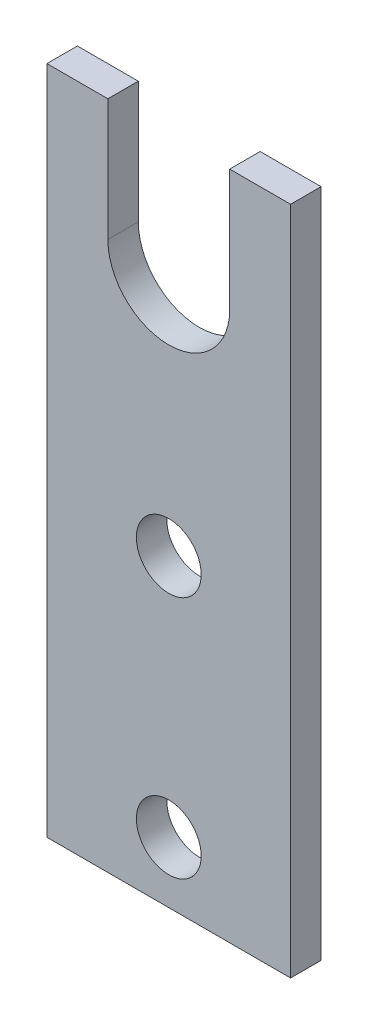
ISO-10303-21;
HEADER;
FILE_DESCRIPTION(('STEP AP214'),'2;1');
FILE_NAME('part.step','',(''),(''),'','','');
FILE_SCHEMA(('AUTOMOTIVE_DESIGN { 1 0 10303 214 1 1 1 1 }'));
ENDSEC;
DATA;
#1=APPLICATION_CONTEXT('core data for automotive mechanical design processes');
#2=APPLICATION_PROTOCOL_DEFINITION('international standard','automotive_design',2000,#1);
#3=PRODUCT_CONTEXT('',#1,'mechanical');
#4=PRODUCT('Part','Part','',(#3));
#5=PRODUCT_RELATED_PRODUCT_CATEGORY('part','',(#4));
#6=PRODUCT_DEFINITION_FORMATION('','',#4);
#7=PRODUCT_DEFINITION_CONTEXT('part definition',#1,'design');
#8=PRODUCT_DEFINITION('design','',#6,#7);
#9=PRODUCT_DEFINITION_SHAPE('','',#8);
#10=(LENGTH_UNIT() NAMED_UNIT(*) SI_UNIT(.MILLI.,.METRE.));
#11=(NAMED_UNIT(*) PLANE_ANGLE_UNIT() SI_UNIT($,.RADIAN.));
#12=(NAMED_UNIT(*) SI_UNIT($,.STERADIAN.) SOLID_ANGLE_UNIT());
#13=UNCERTAINTY_MEASURE_WITH_UNIT(LENGTH_MEASURE(1.E-05),#10,'distance_accuracy_value','');
#14=(GEOMETRIC_REPRESENTATION_CONTEXT(3) GLOBAL_UNCERTAINTY_ASSIGNED_CONTEXT((#13)) GLOBAL_UNIT_ASSIGNED_CONTEXT((#10,
#11,#12)) REPRESENTATION_CONTEXT('',''));
#15=CARTESIAN_POINT('',(0.,0.,0.));
#16=DIRECTION('',(0.,0.,1.));
#17=DIRECTION('',(1.,0.,0.));
#18=AXIS2_PLACEMENT_3D('',#15,#16,#17);
#19=CARTESIAN_POINT('',(-12.7,34.925,3.175));
#20=DIRECTION('',(0.,-1.,0.));
#21=DIRECTION('',(0.,0.,-1.));
#22=AXIS2_PLACEMENT_3D('',#19,#20,#21);
#23=PLANE('',#22);
#24=DIRECTION('',(-1.,0.,0.));
#25=VECTOR('',#24,1.);
#26=CARTESIAN_POINT('',(-12.7,34.925,0.));
#27=LINE('',#26,#25);
#28=CARTESIAN_POINT('',(12.7,34.925,0.));
#29=VERTEX_POINT('',#28);
#30=CARTESIAN_POINT('',(6.34999999999999,34.925,0.));
#31=VERTEX_POINT('',#30);
#32=EDGE_CURVE('E137',#29,#31,#27,.T.);
#33=ORIENTED_EDGE('',*,*,#32,.T.);
#34=DIRECTION('',(0.,0.,1.));
#35=VECTOR('',#34,1.);
#36=CARTESIAN_POINT('',(6.34999999999999,34.925,0.));
#37=LINE('',#36,#35);
#38=CARTESIAN_POINT('',(6.34999999999999,34.925,3.175));
#39=VERTEX_POINT('',#38);
#40=EDGE_CURVE('E143',#31,#39,#37,.T.);
#41=ORIENTED_EDGE('',*,*,#40,.T.);
#42=DIRECTION('',(-1.,0.,0.));
#43=VECTOR('',#42,1.);
#44=CARTESIAN_POINT('',(-12.7,34.925,3.175));
#45=LINE('',#44,#43);
#46=CARTESIAN_POINT('',(12.7,34.925,3.175));
#47=VERTEX_POINT('',#46);
#48=EDGE_CURVE('E91',#47,#39,#45,.T.);
#49=ORIENTED_EDGE('',*,*,#48,.F.);
#50=DIRECTION('',(0.,0.,-1.));
#51=VECTOR('',#50,1.);
#52=CARTESIAN_POINT('',(12.7,34.925,3.175));
#53=LINE('',#52,#51);
#54=EDGE_CURVE('E11',#47,#29,#53,.T.);
#55=ORIENTED_EDGE('',*,*,#54,.T.);
#56=EDGE_LOOP('',(#33,#41,#49,#55));
#57=FACE_BOUND('',#56,.T.);
#58=ADVANCED_FACE('F39',(#57),#23,.F.);
#59=CARTESIAN_POINT('',(12.7,-34.925,3.175));
#60=DIRECTION('',(-1.,0.,0.));
#61=DIRECTION('',(0.,0.,1.));
#62=AXIS2_PLACEMENT_3D('',#59,#60,#61);
#63=PLANE('',#62);
#64=DIRECTION('',(0.,1.,0.));
#65=VECTOR('',#64,1.);
#66=CARTESIAN_POINT('',(12.7,-34.925,0.));
#67=LINE('',#66,#65);
#68=CARTESIAN_POINT('',(12.7,-34.925,0.));
#69=VERTEX_POINT('',#68);
#70=EDGE_CURVE('E138',#69,#29,#67,.T.);
#71=ORIENTED_EDGE('',*,*,#70,.T.);
#72=ORIENTED_EDGE('',*,*,#54,.F.);
#73=DIRECTION('',(0.,1.,0.));
#74=VECTOR('',#73,1.);
#75=CARTESIAN_POINT('',(12.7,-34.925,3.175));
#76=LINE('',#75,#74);
#77=CARTESIAN_POINT('',(12.7,-34.925,3.175));
#78=VERTEX_POINT('',#77);
#79=EDGE_CURVE('E150',#78,#47,#76,.T.);
#80=ORIENTED_EDGE('',*,*,#79,.F.);
#81=DIRECTION('',(0.,0.,-1.));
#82=VECTOR('',#81,1.);
#83=CARTESIAN_POINT('',(12.7,-34.925,3.175));
#84=LINE('',#83,#82);
#85=EDGE_CURVE('E151',#78,#69,#84,.T.);
#86=ORIENTED_EDGE('',*,*,#85,.T.);
#87=EDGE_LOOP('',(#71,#72,#80,#86));
#88=FACE_BOUND('',#87,.T.);
#89=ADVANCED_FACE('F41',(#88),#63,.F.);
#90=CARTESIAN_POINT('',(-6.35,34.925,3.175));
#91=VERTEX_POINT('',#90);
#92=CARTESIAN_POINT('',(-12.7,34.925,3.175));
#93=VERTEX_POINT('',#92);
#94=EDGE_CURVE('E130',#91,#93,#45,.T.);
#95=ORIENTED_EDGE('',*,*,#94,.F.);
#96=DIRECTION('',(0.,0.,1.));
#97=VECTOR('',#96,1.);
#98=CARTESIAN_POINT('',(-6.35,34.925,0.));
#99=LINE('',#98,#97);
#100=CARTESIAN_POINT('',(-6.35,34.925,0.));
#101=VERTEX_POINT('',#100);
#102=EDGE_CURVE('E117',#101,#91,#99,.T.);
#103=ORIENTED_EDGE('',*,*,#102,.F.);
#104=CARTESIAN_POINT('',(-12.7,34.925,0.));
#105=VERTEX_POINT('',#104);
#106=EDGE_CURVE('E128',#101,#105,#27,.T.);
#107=ORIENTED_EDGE('',*,*,#106,.T.);
#108=DIRECTION('',(0.,0.,-1.));
#109=VECTOR('',#108,1.);
#110=CARTESIAN_POINT('',(-12.7,34.925,3.175));
#111=LINE('',#110,#109);
#112=EDGE_CURVE('E47',#93,#105,#111,.T.);
#113=ORIENTED_EDGE('',*,*,#112,.F.);
#114=EDGE_LOOP('',(#95,#103,#107,#113));
#115=FACE_BOUND('',#114,.T.);
#116=ADVANCED_FACE('F126',(#115),#23,.F.);
#117=CARTESIAN_POINT('',(-12.7,-34.925,3.175));
#118=DIRECTION('',(1.,0.,0.));
#119=DIRECTION('',(0.,0.,-1.));
#120=AXIS2_PLACEMENT_3D('',#117,#118,#119);
#121=PLANE('',#120);
#122=DIRECTION('',(0.,-1.,0.));
#123=VECTOR('',#122,1.);
#124=CARTESIAN_POINT('',(-12.7,-34.925,0.));
#125=LINE('',#124,#123);
#126=CARTESIAN_POINT('',(-12.7,-34.925,0.));
#127=VERTEX_POINT('',#126);
#128=EDGE_CURVE('E136',#105,#127,#125,.T.);
#129=ORIENTED_EDGE('',*,*,#128,.T.);
#130=DIRECTION('',(0.,0.,-1.));
#131=VECTOR('',#130,1.);
#132=CARTESIAN_POINT('',(-12.7,-34.925,3.175));
#133=LINE('',#132,#131);
#134=CARTESIAN_POINT('',(-12.7,-34.925,3.175));
#135=VERTEX_POINT('',#134);
#136=EDGE_CURVE('E153',#135,#127,#133,.T.);
#137=ORIENTED_EDGE('',*,*,#136,.F.);
#138=DIRECTION('',(0.,-1.,0.));
#139=VECTOR('',#138,1.);
#140=CARTESIAN_POINT('',(-12.7,-34.925,3.175));
#141=LINE('',#140,#139);
#142=EDGE_CURVE('E158',#93,#135,#141,.T.);
#143=ORIENTED_EDGE('',*,*,#142,.F.);
#144=ORIENTED_EDGE('',*,*,#112,.T.);
#145=EDGE_LOOP('',(#129,#137,#143,#144));
#146=FACE_BOUND('',#145,.T.);
#147=ADVANCED_FACE('F156',(#146),#121,.F.);
#148=CARTESIAN_POINT('',(-12.7,-34.925,3.175));
#149=DIRECTION('',(0.,1.,0.));
#150=DIRECTION('',(0.,0.,1.));
#151=AXIS2_PLACEMENT_3D('',#148,#149,#150);
#152=PLANE('',#151);
#153=DIRECTION('',(1.,0.,0.));
#154=VECTOR('',#153,1.);
#155=CARTESIAN_POINT('',(-12.7,-34.925,0.));
#156=LINE('',#155,#154);
#157=EDGE_CURVE('E84',#127,#69,#156,.T.);
#158=ORIENTED_EDGE('',*,*,#157,.T.);
#159=ORIENTED_EDGE('',*,*,#85,.F.);
#160=DIRECTION('',(1.,0.,0.));
#161=VECTOR('',#160,1.);
#162=CARTESIAN_POINT('',(-12.7,-34.925,3.175));
#163=LINE('',#162,#161);
#164=EDGE_CURVE('E63',#135,#78,#163,.T.);
#165=ORIENTED_EDGE('',*,*,#164,.F.);
#166=ORIENTED_EDGE('',*,*,#136,.T.);
#167=EDGE_LOOP('',(#158,#159,#165,#166));
#168=FACE_BOUND('',#167,.T.);
#169=ADVANCED_FACE('F197',(#168),#152,.F.);
#170=CARTESIAN_POINT('',(0.,0.,3.175));
#171=DIRECTION('',(0.,0.,-1.));
#172=DIRECTION('',(-1.,0.,0.));
#173=AXIS2_PLACEMENT_3D('',#170,#171,#172);
#174=PLANE('',#173);
#175=CARTESIAN_POINT('',(0.,-28.575,3.175));
#176=DIRECTION('',(0.,0.,1.));
#177=DIRECTION('',(1.,0.,0.));
#178=AXIS2_PLACEMENT_3D('',#175,#176,#177);
#179=CIRCLE('',#178,3.37819999999999);
#180=CARTESIAN_POINT('',(3.37819999999999,-28.575,3.175));
#181=VERTEX_POINT('',#180);
#182=EDGE_CURVE('E188',#181,#181,#179,.T.);
#183=ORIENTED_EDGE('',*,*,#182,.F.);
#184=EDGE_LOOP('',(#183));
#185=FACE_BOUND('',#184,.T.);
#186=CARTESIAN_POINT('',(0.,-3.175,3.175));
#187=DIRECTION('',(0.,0.,1.));
#188=DIRECTION('',(1.,0.,0.));
#189=AXIS2_PLACEMENT_3D('',#186,#187,#188);
#190=CIRCLE('',#189,3.37819999999999);
#191=CARTESIAN_POINT('',(3.37819999999999,-3.175,3.175));
#192=VERTEX_POINT('',#191);
#193=EDGE_CURVE('E182',#192,#192,#190,.T.);
#194=ORIENTED_EDGE('',*,*,#193,.F.);
#195=EDGE_LOOP('',(#194));
#196=FACE_BOUND('',#195,.T.);
#197=ORIENTED_EDGE('',*,*,#48,.T.);
#198=DIRECTION('',(0.,1.,0.));
#199=VECTOR('',#198,1.);
#200=CARTESIAN_POINT('',(6.35,22.225,3.175));
#201=LINE('',#200,#199);
#202=CARTESIAN_POINT('',(6.35,22.225,3.175));
#203=VERTEX_POINT('',#202);
#204=EDGE_CURVE('E122',#203,#39,#201,.T.);
#205=ORIENTED_EDGE('',*,*,#204,.F.);
#206=CARTESIAN_POINT('',(0.,22.225,3.175));
#207=DIRECTION('',(0.,0.,1.));
#208=DIRECTION('',(1.,0.,0.));
#209=AXIS2_PLACEMENT_3D('',#206,#207,#208);
#210=CIRCLE('',#209,6.35);
#211=CARTESIAN_POINT('',(-6.35,22.225,3.175));
#212=VERTEX_POINT('',#211);
#213=EDGE_CURVE('E171',#212,#203,#210,.T.);
#214=ORIENTED_EDGE('',*,*,#213,.F.);
#215=DIRECTION('',(0.,-1.,0.));
#216=VECTOR('',#215,1.);
#217=CARTESIAN_POINT('',(-6.35,34.925,3.175));
#218=LINE('',#217,#216);
#219=EDGE_CURVE('E174',#91,#212,#218,.T.);
#220=ORIENTED_EDGE('',*,*,#219,.F.);
#221=ORIENTED_EDGE('',*,*,#94,.T.);
#222=ORIENTED_EDGE('',*,*,#142,.T.);
#223=ORIENTED_EDGE('',*,*,#164,.T.);
#224=ORIENTED_EDGE('',*,*,#79,.T.);
#225=EDGE_LOOP('',(#197,#205,#214,#220,#221,#222,#223,#224));
#226=FACE_BOUND('',#225,.T.);
#227=ADVANCED_FACE('F194',(#185,#196,#226),#174,.F.);
#228=CARTESIAN_POINT('',(0.,0.,0.));
#229=DIRECTION('',(0.,0.,-1.));
#230=DIRECTION('',(-1.,0.,0.));
#231=AXIS2_PLACEMENT_3D('',#228,#229,#230);
#232=PLANE('',#231);
#233=CARTESIAN_POINT('',(0.,-28.575,0.));
#234=DIRECTION('',(0.,0.,1.));
#235=DIRECTION('',(1.,0.,0.));
#236=AXIS2_PLACEMENT_3D('',#233,#234,#235);
#237=CIRCLE('',#236,3.3782);
#238=CARTESIAN_POINT('',(3.3782,-28.575,0.));
#239=VERTEX_POINT('',#238);
#240=EDGE_CURVE('E185',#239,#239,#237,.T.);
#241=ORIENTED_EDGE('',*,*,#240,.T.);
#242=EDGE_LOOP('',(#241));
#243=FACE_BOUND('',#242,.T.);
#244=CARTESIAN_POINT('',(0.,-3.175,0.));
#245=DIRECTION('',(0.,0.,1.));
#246=DIRECTION('',(1.,0.,0.));
#247=AXIS2_PLACEMENT_3D('',#244,#245,#246);
#248=CIRCLE('',#247,3.3782);
#249=CARTESIAN_POINT('',(3.3782,-3.175,0.));
#250=VERTEX_POINT('',#249);
#251=EDGE_CURVE('E176',#250,#250,#248,.T.);
#252=ORIENTED_EDGE('',*,*,#251,.T.);
#253=EDGE_LOOP('',(#252));
#254=FACE_BOUND('',#253,.T.);
#255=DIRECTION('',(0.,1.,0.));
#256=VECTOR('',#255,1.);
#257=CARTESIAN_POINT('',(6.35,22.225,0.));
#258=LINE('',#257,#256);
#259=CARTESIAN_POINT('',(6.35,22.225,0.));
#260=VERTEX_POINT('',#259);
#261=EDGE_CURVE('E131',#260,#31,#258,.T.);
#262=ORIENTED_EDGE('',*,*,#261,.T.);
#263=ORIENTED_EDGE('',*,*,#32,.F.);
#264=ORIENTED_EDGE('',*,*,#70,.F.);
#265=ORIENTED_EDGE('',*,*,#157,.F.);
#266=ORIENTED_EDGE('',*,*,#128,.F.);
#267=ORIENTED_EDGE('',*,*,#106,.F.);
#268=DIRECTION('',(0.,-1.,0.));
#269=VECTOR('',#268,1.);
#270=CARTESIAN_POINT('',(-6.35,34.925,0.));
#271=LINE('',#270,#269);
#272=CARTESIAN_POINT('',(-6.35,22.225,0.));
#273=VERTEX_POINT('',#272);
#274=EDGE_CURVE('E113',#101,#273,#271,.T.);
#275=ORIENTED_EDGE('',*,*,#274,.T.);
#276=CARTESIAN_POINT('',(0.,22.225,0.));
#277=DIRECTION('',(0.,0.,1.));
#278=DIRECTION('',(1.,0.,0.));
#279=AXIS2_PLACEMENT_3D('',#276,#277,#278);
#280=CIRCLE('',#279,6.35);
#281=EDGE_CURVE('E54',#273,#260,#280,.T.);
#282=ORIENTED_EDGE('',*,*,#281,.T.);
#283=EDGE_LOOP('',(#262,#263,#264,#265,#266,#267,#275,#282));
#284=FACE_BOUND('',#283,.T.);
#285=ADVANCED_FACE('F135',(#243,#254,#284),#232,.T.);
#286=CARTESIAN_POINT('',(6.35,22.225,0.));
#287=DIRECTION('',(1.,0.,0.));
#288=DIRECTION('',(0.,1.,0.));
#289=AXIS2_PLACEMENT_3D('',#286,#287,#288);
#290=PLANE('',#289);
#291=ORIENTED_EDGE('',*,*,#204,.T.);
#292=ORIENTED_EDGE('',*,*,#40,.F.);
#293=ORIENTED_EDGE('',*,*,#261,.F.);
#294=DIRECTION('',(0.,0.,1.));
#295=VECTOR('',#294,1.);
#296=CARTESIAN_POINT('',(6.35,22.225,0.));
#297=LINE('',#296,#295);
#298=EDGE_CURVE('E167',#260,#203,#297,.T.);
#299=ORIENTED_EDGE('',*,*,#298,.T.);
#300=EDGE_LOOP('',(#291,#292,#293,#299));
#301=FACE_BOUND('',#300,.T.);
#302=ADVANCED_FACE('F208',(#301),#290,.F.);
#303=CARTESIAN_POINT('',(0.,22.225,0.));
#304=DIRECTION('',(0.,0.,1.));
#305=DIRECTION('',(1.,0.,0.));
#306=AXIS2_PLACEMENT_3D('',#303,#304,#305);
#307=CYLINDRICAL_SURFACE('',#306,6.35);
#308=ORIENTED_EDGE('',*,*,#213,.T.);
#309=ORIENTED_EDGE('',*,*,#298,.F.);
#310=ORIENTED_EDGE('',*,*,#281,.F.);
#311=DIRECTION('',(0.,0.,1.));
#312=VECTOR('',#311,1.);
#313=CARTESIAN_POINT('',(-6.35,22.225,0.));
#314=LINE('',#313,#312);
#315=EDGE_CURVE('E119',#273,#212,#314,.T.);
#316=ORIENTED_EDGE('',*,*,#315,.T.);
#317=EDGE_LOOP('',(#308,#309,#310,#316));
#318=FACE_BOUND('',#317,.T.);
#319=ADVANCED_FACE('F209',(#318),#307,.F.);
#320=CARTESIAN_POINT('',(-6.35,34.925,0.));
#321=DIRECTION('',(-1.,0.,0.));
#322=DIRECTION('',(0.,-1.,0.));
#323=AXIS2_PLACEMENT_3D('',#320,#321,#322);
#324=PLANE('',#323);
#325=ORIENTED_EDGE('',*,*,#219,.T.);
#326=ORIENTED_EDGE('',*,*,#315,.F.);
#327=ORIENTED_EDGE('',*,*,#274,.F.);
#328=ORIENTED_EDGE('',*,*,#102,.T.);
#329=EDGE_LOOP('',(#325,#326,#327,#328));
#330=FACE_BOUND('',#329,.T.);
#331=ADVANCED_FACE('F116',(#330),#324,.F.);
#332=CARTESIAN_POINT('',(0.,-3.175,3.175));
#333=DIRECTION('',(0.,0.,1.));
#334=DIRECTION('',(1.,0.,0.));
#335=AXIS2_PLACEMENT_3D('',#332,#333,#334);
#336=CYLINDRICAL_SURFACE('',#335,3.37819999999999);
#337=ORIENTED_EDGE('',*,*,#251,.F.);
#338=EDGE_LOOP('',(#337));
#339=FACE_BOUND('',#338,.T.);
#340=ORIENTED_EDGE('',*,*,#193,.T.);
#341=EDGE_LOOP('',(#340));
#342=FACE_BOUND('',#341,.T.);
#343=ADVANCED_FACE('F216',(#339,#342),#336,.F.);
#344=CARTESIAN_POINT('',(0.,-28.575,3.175));
#345=DIRECTION('',(0.,0.,1.));
#346=DIRECTION('',(1.,0.,0.));
#347=AXIS2_PLACEMENT_3D('',#344,#345,#346);
#348=CYLINDRICAL_SURFACE('',#347,3.37819999999999);
#349=ORIENTED_EDGE('',*,*,#240,.F.);
#350=EDGE_LOOP('',(#349));
#351=FACE_BOUND('',#350,.T.);
#352=ORIENTED_EDGE('',*,*,#182,.T.);
#353=EDGE_LOOP('',(#352));
#354=FACE_BOUND('',#353,.T.);
#355=ADVANCED_FACE('F192',(#351,#354),#348,.F.);
#356=CLOSED_SHELL('',(#58,#89,#116,#147,#169,#227,#285,#302,#319,#331,#343,#355));
#357=MANIFOLD_SOLID_BREP('B2',#356);
#358=ADVANCED_BREP_SHAPE_REPRESENTATION('',(#18,#357),#14);
#359=SHAPE_DEFINITION_REPRESENTATION(#9,#358);
ENDSEC;
END-ISO-10303-21;
